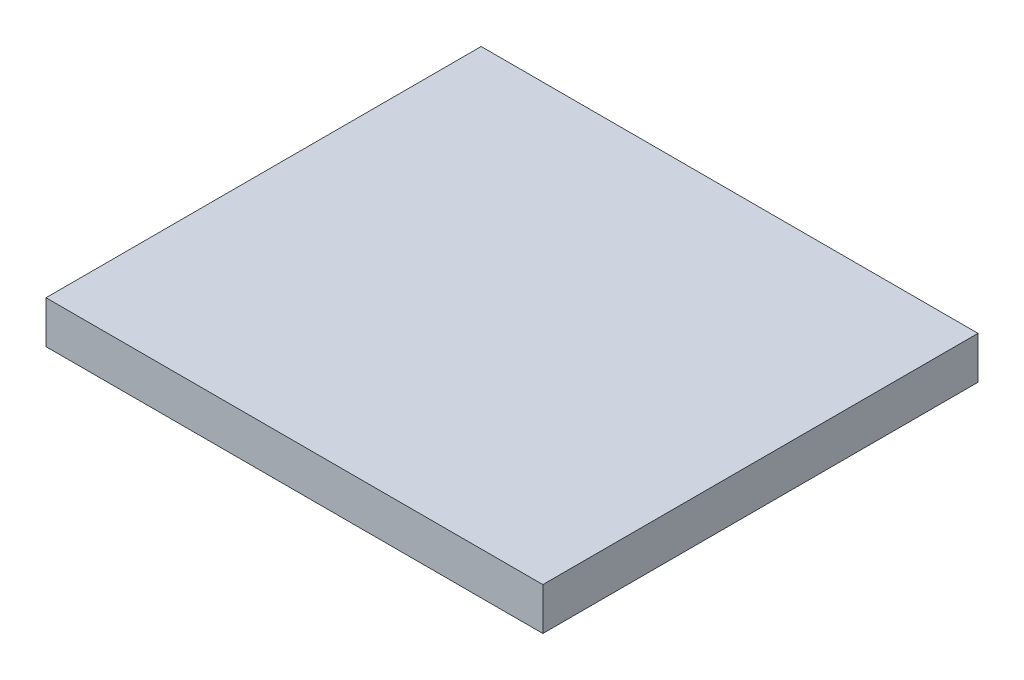
ISO-10303-21;
HEADER;
FILE_DESCRIPTION(('STEP AP214'),'2;1');
FILE_NAME('part.step','',(''),(''),'','','');
FILE_SCHEMA(('AUTOMOTIVE_DESIGN { 1 0 10303 214 1 1 1 1 }'));
ENDSEC;
DATA;
#1=APPLICATION_CONTEXT('core data for automotive mechanical design processes');
#2=APPLICATION_PROTOCOL_DEFINITION('international standard','automotive_design',2000,#1);
#3=PRODUCT_CONTEXT('',#1,'mechanical');
#4=PRODUCT('Part','Part','',(#3));
#5=PRODUCT_RELATED_PRODUCT_CATEGORY('part','',(#4));
#6=PRODUCT_DEFINITION_FORMATION('','',#4);
#7=PRODUCT_DEFINITION_CONTEXT('part definition',#1,'design');
#8=PRODUCT_DEFINITION('design','',#6,#7);
#9=PRODUCT_DEFINITION_SHAPE('','',#8);
#10=(LENGTH_UNIT() NAMED_UNIT(*) SI_UNIT(.MILLI.,.METRE.));
#11=(NAMED_UNIT(*) PLANE_ANGLE_UNIT() SI_UNIT($,.RADIAN.));
#12=(NAMED_UNIT(*) SI_UNIT($,.STERADIAN.) SOLID_ANGLE_UNIT());
#13=UNCERTAINTY_MEASURE_WITH_UNIT(LENGTH_MEASURE(1.E-05),#10,'distance_accuracy_value','');
#14=(GEOMETRIC_REPRESENTATION_CONTEXT(3) GLOBAL_UNCERTAINTY_ASSIGNED_CONTEXT((#13)) GLOBAL_UNIT_ASSIGNED_CONTEXT((#10,
#11,#12)) REPRESENTATION_CONTEXT('',''));
#15=CARTESIAN_POINT('',(0.,0.,0.));
#16=DIRECTION('',(0.,0.,1.));
#17=DIRECTION('',(1.,0.,0.));
#18=AXIS2_PLACEMENT_3D('',#15,#16,#17);
#19=CARTESIAN_POINT('',(29.3069690992768,5.,25.668862590401));
#20=DIRECTION('',(-1.,0.,0.));
#21=DIRECTION('',(0.,0.,1.));
#22=AXIS2_PLACEMENT_3D('',#19,#20,#21);
#23=PLANE('',#22);
#24=DIRECTION('',(0.,0.,-1.));
#25=VECTOR('',#24,1.);
#26=CARTESIAN_POINT('',(29.3069690992768,0.,25.668862590401));
#27=LINE('',#26,#25);
#28=CARTESIAN_POINT('',(29.3069690992768,0.,25.668862590401));
#29=VERTEX_POINT('',#28);
#30=CARTESIAN_POINT('',(29.3069690992768,0.,-25.668862590401));
#31=VERTEX_POINT('',#30);
#32=EDGE_CURVE('E113',#29,#31,#27,.T.);
#33=ORIENTED_EDGE('',*,*,#32,.T.);
#34=DIRECTION('',(0.,-1.,0.));
#35=VECTOR('',#34,1.);
#36=CARTESIAN_POINT('',(29.3069690992768,5.,-25.668862590401));
#37=LINE('',#36,#35);
#38=CARTESIAN_POINT('',(29.3069690992768,5.,-25.668862590401));
#39=VERTEX_POINT('',#38);
#40=EDGE_CURVE('E11',#39,#31,#37,.T.);
#41=ORIENTED_EDGE('',*,*,#40,.F.);
#42=DIRECTION('',(0.,0.,-1.));
#43=VECTOR('',#42,1.);
#44=CARTESIAN_POINT('',(29.3069690992768,5.,25.668862590401));
#45=LINE('',#44,#43);
#46=CARTESIAN_POINT('',(29.3069690992768,5.,25.668862590401));
#47=VERTEX_POINT('',#46);
#48=EDGE_CURVE('E97',#47,#39,#45,.T.);
#49=ORIENTED_EDGE('',*,*,#48,.F.);
#50=DIRECTION('',(0.,-1.,0.));
#51=VECTOR('',#50,1.);
#52=CARTESIAN_POINT('',(29.3069690992768,5.,25.668862590401));
#53=LINE('',#52,#51);
#54=EDGE_CURVE('E109',#47,#29,#53,.T.);
#55=ORIENTED_EDGE('',*,*,#54,.T.);
#56=EDGE_LOOP('',(#33,#41,#49,#55));
#57=FACE_BOUND('',#56,.T.);
#58=ADVANCED_FACE('F45',(#57),#23,.F.);
#59=CARTESIAN_POINT('',(-29.3069690992768,5.,-25.668862590401));
#60=DIRECTION('',(0.,0.,1.));
#61=DIRECTION('',(1.,0.,0.));
#62=AXIS2_PLACEMENT_3D('',#59,#60,#61);
#63=PLANE('',#62);
#64=DIRECTION('',(-1.,0.,0.));
#65=VECTOR('',#64,1.);
#66=CARTESIAN_POINT('',(-29.3069690992768,0.,-25.668862590401));
#67=LINE('',#66,#65);
#68=CARTESIAN_POINT('',(-29.3069690992768,0.,-25.668862590401));
#69=VERTEX_POINT('',#68);
#70=EDGE_CURVE('E102',#31,#69,#67,.T.);
#71=ORIENTED_EDGE('',*,*,#70,.T.);
#72=DIRECTION('',(0.,-1.,0.));
#73=VECTOR('',#72,1.);
#74=CARTESIAN_POINT('',(-29.3069690992768,5.,-25.668862590401));
#75=LINE('',#74,#73);
#76=CARTESIAN_POINT('',(-29.3069690992768,5.,-25.668862590401));
#77=VERTEX_POINT('',#76);
#78=EDGE_CURVE('E54',#77,#69,#75,.T.);
#79=ORIENTED_EDGE('',*,*,#78,.F.);
#80=DIRECTION('',(-1.,0.,0.));
#81=VECTOR('',#80,1.);
#82=CARTESIAN_POINT('',(-29.3069690992768,5.,-25.668862590401));
#83=LINE('',#82,#81);
#84=EDGE_CURVE('E92',#39,#77,#83,.T.);
#85=ORIENTED_EDGE('',*,*,#84,.F.);
#86=ORIENTED_EDGE('',*,*,#40,.T.);
#87=EDGE_LOOP('',(#71,#79,#85,#86));
#88=FACE_BOUND('',#87,.T.);
#89=ADVANCED_FACE('F101',(#88),#63,.F.);
#90=CARTESIAN_POINT('',(-29.3069690992768,5.,25.668862590401));
#91=DIRECTION('',(1.,0.,0.));
#92=DIRECTION('',(0.,0.,-1.));
#93=AXIS2_PLACEMENT_3D('',#90,#91,#92);
#94=PLANE('',#93);
#95=DIRECTION('',(0.,0.,1.));
#96=VECTOR('',#95,1.);
#97=CARTESIAN_POINT('',(-29.3069690992768,0.,25.668862590401));
#98=LINE('',#97,#96);
#99=CARTESIAN_POINT('',(-29.3069690992768,0.,25.668862590401));
#100=VERTEX_POINT('',#99);
#101=EDGE_CURVE('E79',#69,#100,#98,.T.);
#102=ORIENTED_EDGE('',*,*,#101,.T.);
#103=DIRECTION('',(0.,-1.,0.));
#104=VECTOR('',#103,1.);
#105=CARTESIAN_POINT('',(-29.3069690992768,5.,25.668862590401));
#106=LINE('',#105,#104);
#107=CARTESIAN_POINT('',(-29.3069690992768,5.,25.668862590401));
#108=VERTEX_POINT('',#107);
#109=EDGE_CURVE('E104',#108,#100,#106,.T.);
#110=ORIENTED_EDGE('',*,*,#109,.F.);
#111=DIRECTION('',(0.,0.,1.));
#112=VECTOR('',#111,1.);
#113=CARTESIAN_POINT('',(-29.3069690992768,5.,25.668862590401));
#114=LINE('',#113,#112);
#115=EDGE_CURVE('E95',#77,#108,#114,.T.);
#116=ORIENTED_EDGE('',*,*,#115,.F.);
#117=ORIENTED_EDGE('',*,*,#78,.T.);
#118=EDGE_LOOP('',(#102,#110,#116,#117));
#119=FACE_BOUND('',#118,.T.);
#120=ADVANCED_FACE('F105',(#119),#94,.F.);
#121=CARTESIAN_POINT('',(-29.3069690992768,5.,25.668862590401));
#122=DIRECTION('',(0.,0.,-1.));
#123=DIRECTION('',(-1.,0.,0.));
#124=AXIS2_PLACEMENT_3D('',#121,#122,#123);
#125=PLANE('',#124);
#126=DIRECTION('',(1.,0.,0.));
#127=VECTOR('',#126,1.);
#128=CARTESIAN_POINT('',(-29.3069690992768,0.,25.668862590401));
#129=LINE('',#128,#127);
#130=EDGE_CURVE('E85',#100,#29,#129,.T.);
#131=ORIENTED_EDGE('',*,*,#130,.T.);
#132=ORIENTED_EDGE('',*,*,#54,.F.);
#133=DIRECTION('',(1.,0.,0.));
#134=VECTOR('',#133,1.);
#135=CARTESIAN_POINT('',(-29.3069690992768,5.,25.668862590401));
#136=LINE('',#135,#134);
#137=EDGE_CURVE('E62',#108,#47,#136,.T.);
#138=ORIENTED_EDGE('',*,*,#137,.F.);
#139=ORIENTED_EDGE('',*,*,#109,.T.);
#140=EDGE_LOOP('',(#131,#132,#138,#139));
#141=FACE_BOUND('',#140,.T.);
#142=ADVANCED_FACE('F126',(#141),#125,.F.);
#143=CARTESIAN_POINT('',(0.,5.,0.));
#144=DIRECTION('',(0.,-1.,0.));
#145=DIRECTION('',(0.,0.,-1.));
#146=AXIS2_PLACEMENT_3D('',#143,#144,#145);
#147=PLANE('',#146);
#148=ORIENTED_EDGE('',*,*,#48,.T.);
#149=ORIENTED_EDGE('',*,*,#84,.T.);
#150=ORIENTED_EDGE('',*,*,#115,.T.);
#151=ORIENTED_EDGE('',*,*,#137,.T.);
#152=EDGE_LOOP('',(#148,#149,#150,#151));
#153=FACE_BOUND('',#152,.T.);
#154=ADVANCED_FACE('F93',(#153),#147,.F.);
#155=CARTESIAN_POINT('',(0.,0.,0.));
#156=DIRECTION('',(0.,-1.,0.));
#157=DIRECTION('',(0.,0.,-1.));
#158=AXIS2_PLACEMENT_3D('',#155,#156,#157);
#159=PLANE('',#158);
#160=ORIENTED_EDGE('',*,*,#32,.F.);
#161=ORIENTED_EDGE('',*,*,#130,.F.);
#162=ORIENTED_EDGE('',*,*,#101,.F.);
#163=ORIENTED_EDGE('',*,*,#70,.F.);
#164=EDGE_LOOP('',(#160,#161,#162,#163));
#165=FACE_BOUND('',#164,.T.);
#166=ADVANCED_FACE('F129',(#165),#159,.T.);
#167=CLOSED_SHELL('',(#58,#89,#120,#142,#154,#166));
#168=MANIFOLD_SOLID_BREP('B2',#167);
#169=ADVANCED_BREP_SHAPE_REPRESENTATION('',(#18,#168),#14);
#170=SHAPE_DEFINITION_REPRESENTATION(#9,#169);
ENDSEC;
END-ISO-10303-21;
